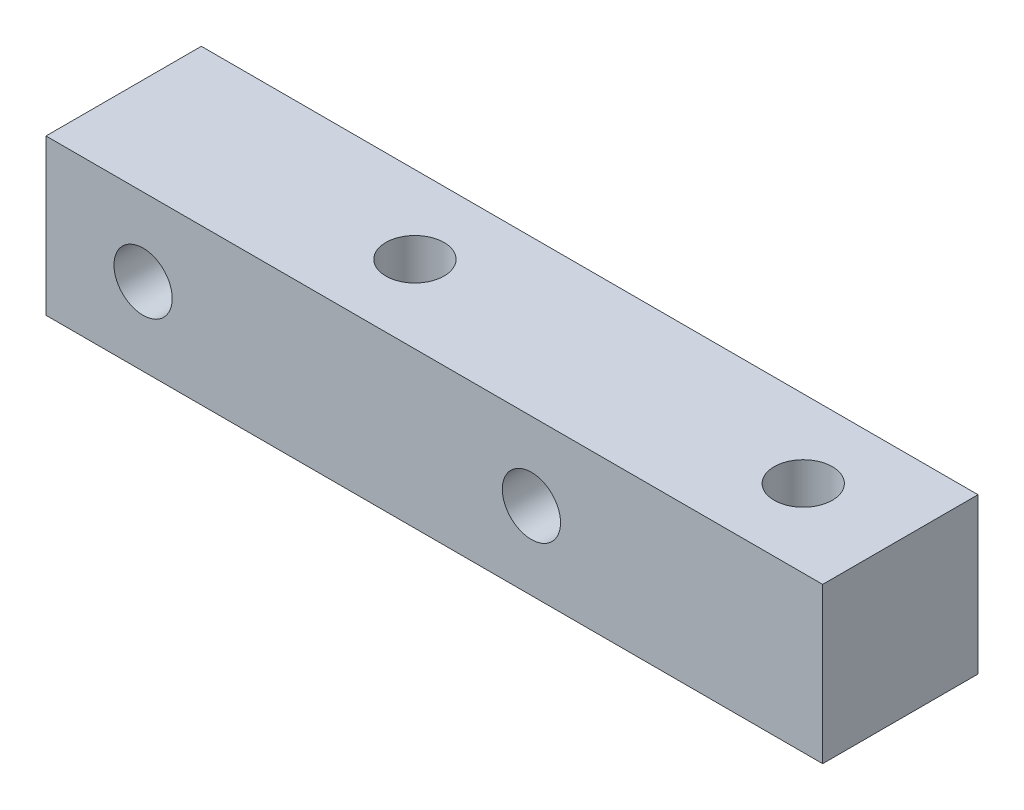
ISO-10303-21;
HEADER;
FILE_DESCRIPTION(('STEP AP214'),'2;1');
FILE_NAME('part.step','',(''),(''),'','','');
FILE_SCHEMA(('AUTOMOTIVE_DESIGN { 1 0 10303 214 1 1 1 1 }'));
ENDSEC;
DATA;
#1=APPLICATION_CONTEXT('core data for automotive mechanical design processes');
#2=APPLICATION_PROTOCOL_DEFINITION('international standard','automotive_design',2000,#1);
#3=PRODUCT_CONTEXT('',#1,'mechanical');
#4=PRODUCT('Part','Part','',(#3));
#5=PRODUCT_RELATED_PRODUCT_CATEGORY('part','',(#4));
#6=PRODUCT_DEFINITION_FORMATION('','',#4);
#7=PRODUCT_DEFINITION_CONTEXT('part definition',#1,'design');
#8=PRODUCT_DEFINITION('design','',#6,#7);
#9=PRODUCT_DEFINITION_SHAPE('','',#8);
#10=(LENGTH_UNIT() NAMED_UNIT(*) SI_UNIT(.MILLI.,.METRE.));
#11=(NAMED_UNIT(*) PLANE_ANGLE_UNIT() SI_UNIT($,.RADIAN.));
#12=(NAMED_UNIT(*) SI_UNIT($,.STERADIAN.) SOLID_ANGLE_UNIT());
#13=UNCERTAINTY_MEASURE_WITH_UNIT(LENGTH_MEASURE(1.E-05),#10,'distance_accuracy_value','');
#14=(GEOMETRIC_REPRESENTATION_CONTEXT(3) GLOBAL_UNCERTAINTY_ASSIGNED_CONTEXT((#13)) GLOBAL_UNIT_ASSIGNED_CONTEXT((#10,
#11,#12)) REPRESENTATION_CONTEXT('',''));
#15=CARTESIAN_POINT('',(0.,0.,0.));
#16=DIRECTION('',(0.,0.,1.));
#17=DIRECTION('',(1.,0.,0.));
#18=AXIS2_PLACEMENT_3D('',#15,#16,#17);
#19=CARTESIAN_POINT('',(20.,8.,4.));
#20=DIRECTION('',(-1.,0.,0.));
#21=DIRECTION('',(0.,0.,1.));
#22=AXIS2_PLACEMENT_3D('',#19,#20,#21);
#23=PLANE('',#22);
#24=DIRECTION('',(0.,0.,-1.));
#25=VECTOR('',#24,1.);
#26=CARTESIAN_POINT('',(20.,0.,4.));
#27=LINE('',#26,#25);
#28=CARTESIAN_POINT('',(20.,0.,4.));
#29=VERTEX_POINT('',#28);
#30=CARTESIAN_POINT('',(20.,0.,-4.));
#31=VERTEX_POINT('',#30);
#32=EDGE_CURVE('E103',#29,#31,#27,.T.);
#33=ORIENTED_EDGE('',*,*,#32,.T.);
#34=DIRECTION('',(0.,-1.,0.));
#35=VECTOR('',#34,1.);
#36=CARTESIAN_POINT('',(20.,8.,-4.));
#37=LINE('',#36,#35);
#38=CARTESIAN_POINT('',(20.,8.,-4.));
#39=VERTEX_POINT('',#38);
#40=EDGE_CURVE('E11',#39,#31,#37,.T.);
#41=ORIENTED_EDGE('',*,*,#40,.F.);
#42=DIRECTION('',(0.,0.,-1.));
#43=VECTOR('',#42,1.);
#44=CARTESIAN_POINT('',(20.,8.,4.));
#45=LINE('',#44,#43);
#46=CARTESIAN_POINT('',(20.,8.,4.));
#47=VERTEX_POINT('',#46);
#48=EDGE_CURVE('E91',#47,#39,#45,.T.);
#49=ORIENTED_EDGE('',*,*,#48,.F.);
#50=DIRECTION('',(0.,-1.,0.));
#51=VECTOR('',#50,1.);
#52=CARTESIAN_POINT('',(20.,8.,4.));
#53=LINE('',#52,#51);
#54=EDGE_CURVE('E99',#47,#29,#53,.T.);
#55=ORIENTED_EDGE('',*,*,#54,.T.);
#56=EDGE_LOOP('',(#33,#41,#49,#55));
#57=FACE_BOUND('',#56,.T.);
#58=ADVANCED_FACE('F40',(#57),#23,.F.);
#59=CARTESIAN_POINT('',(-20.,8.,-4.));
#60=DIRECTION('',(0.,0.,1.));
#61=DIRECTION('',(1.,0.,0.));
#62=AXIS2_PLACEMENT_3D('',#59,#60,#61);
#63=PLANE('',#62);
#64=CARTESIAN_POINT('',(-15.,4.,-4.));
#65=DIRECTION('',(0.,0.,1.));
#66=DIRECTION('',(1.,0.,0.));
#67=AXIS2_PLACEMENT_3D('',#64,#65,#66);
#68=CIRCLE('',#67,1.5);
#69=CARTESIAN_POINT('',(-13.5,4.,-4.));
#70=VERTEX_POINT('',#69);
#71=EDGE_CURVE('E106',#70,#70,#68,.T.);
#72=ORIENTED_EDGE('',*,*,#71,.T.);
#73=EDGE_LOOP('',(#72));
#74=FACE_BOUND('',#73,.T.);
#75=CARTESIAN_POINT('',(5.,4.,-4.));
#76=DIRECTION('',(0.,0.,1.));
#77=DIRECTION('',(1.,0.,0.));
#78=AXIS2_PLACEMENT_3D('',#75,#76,#77);
#79=CIRCLE('',#78,1.5);
#80=CARTESIAN_POINT('',(6.5,4.,-4.));
#81=VERTEX_POINT('',#80);
#82=EDGE_CURVE('E117',#81,#81,#79,.T.);
#83=ORIENTED_EDGE('',*,*,#82,.T.);
#84=EDGE_LOOP('',(#83));
#85=FACE_BOUND('',#84,.T.);
#86=DIRECTION('',(-1.,0.,0.));
#87=VECTOR('',#86,1.);
#88=CARTESIAN_POINT('',(-20.,0.,-4.));
#89=LINE('',#88,#87);
#90=CARTESIAN_POINT('',(-20.,0.,-4.));
#91=VERTEX_POINT('',#90);
#92=EDGE_CURVE('E95',#31,#91,#89,.T.);
#93=ORIENTED_EDGE('',*,*,#92,.T.);
#94=DIRECTION('',(0.,-1.,0.));
#95=VECTOR('',#94,1.);
#96=CARTESIAN_POINT('',(-20.,8.,-4.));
#97=LINE('',#96,#95);
#98=CARTESIAN_POINT('',(-20.,8.,-4.));
#99=VERTEX_POINT('',#98);
#100=EDGE_CURVE('E48',#99,#91,#97,.T.);
#101=ORIENTED_EDGE('',*,*,#100,.F.);
#102=DIRECTION('',(-1.,0.,0.));
#103=VECTOR('',#102,1.);
#104=CARTESIAN_POINT('',(-20.,8.,-4.));
#105=LINE('',#104,#103);
#106=EDGE_CURVE('E86',#39,#99,#105,.T.);
#107=ORIENTED_EDGE('',*,*,#106,.F.);
#108=ORIENTED_EDGE('',*,*,#40,.T.);
#109=EDGE_LOOP('',(#93,#101,#107,#108));
#110=FACE_BOUND('',#109,.T.);
#111=ADVANCED_FACE('F94',(#74,#85,#110),#63,.F.);
#112=CARTESIAN_POINT('',(-20.,8.,4.));
#113=DIRECTION('',(1.,0.,0.));
#114=DIRECTION('',(0.,0.,-1.));
#115=AXIS2_PLACEMENT_3D('',#112,#113,#114);
#116=PLANE('',#115);
#117=DIRECTION('',(0.,0.,1.));
#118=VECTOR('',#117,1.);
#119=CARTESIAN_POINT('',(-20.,0.,4.));
#120=LINE('',#119,#118);
#121=CARTESIAN_POINT('',(-20.,0.,4.));
#122=VERTEX_POINT('',#121);
#123=EDGE_CURVE('E73',#91,#122,#120,.T.);
#124=ORIENTED_EDGE('',*,*,#123,.T.);
#125=DIRECTION('',(0.,-1.,0.));
#126=VECTOR('',#125,1.);
#127=CARTESIAN_POINT('',(-20.,8.,4.));
#128=LINE('',#127,#126);
#129=CARTESIAN_POINT('',(-20.,8.,4.));
#130=VERTEX_POINT('',#129);
#131=EDGE_CURVE('E96',#130,#122,#128,.T.);
#132=ORIENTED_EDGE('',*,*,#131,.F.);
#133=DIRECTION('',(0.,0.,1.));
#134=VECTOR('',#133,1.);
#135=CARTESIAN_POINT('',(-20.,8.,4.));
#136=LINE('',#135,#134);
#137=EDGE_CURVE('E89',#99,#130,#136,.T.);
#138=ORIENTED_EDGE('',*,*,#137,.F.);
#139=ORIENTED_EDGE('',*,*,#100,.T.);
#140=EDGE_LOOP('',(#124,#132,#138,#139));
#141=FACE_BOUND('',#140,.T.);
#142=ADVANCED_FACE('F97',(#141),#116,.F.);
#143=CARTESIAN_POINT('',(-20.,8.,4.));
#144=DIRECTION('',(0.,0.,-1.));
#145=DIRECTION('',(-1.,0.,0.));
#146=AXIS2_PLACEMENT_3D('',#143,#144,#145);
#147=PLANE('',#146);
#148=CARTESIAN_POINT('',(-15.,4.,4.));
#149=DIRECTION('',(0.,0.,1.));
#150=DIRECTION('',(1.,0.,0.));
#151=AXIS2_PLACEMENT_3D('',#148,#149,#150);
#152=CIRCLE('',#151,1.5);
#153=CARTESIAN_POINT('',(-13.5,4.,4.));
#154=VERTEX_POINT('',#153);
#155=EDGE_CURVE('E124',#154,#154,#152,.T.);
#156=ORIENTED_EDGE('',*,*,#155,.F.);
#157=EDGE_LOOP('',(#156));
#158=FACE_BOUND('',#157,.T.);
#159=CARTESIAN_POINT('',(5.,4.,4.));
#160=DIRECTION('',(0.,0.,1.));
#161=DIRECTION('',(1.,0.,0.));
#162=AXIS2_PLACEMENT_3D('',#159,#160,#161);
#163=CIRCLE('',#162,1.5);
#164=CARTESIAN_POINT('',(6.5,4.,4.));
#165=VERTEX_POINT('',#164);
#166=EDGE_CURVE('E120',#165,#165,#163,.T.);
#167=ORIENTED_EDGE('',*,*,#166,.F.);
#168=EDGE_LOOP('',(#167));
#169=FACE_BOUND('',#168,.T.);
#170=DIRECTION('',(1.,0.,0.));
#171=VECTOR('',#170,1.);
#172=CARTESIAN_POINT('',(-20.,0.,4.));
#173=LINE('',#172,#171);
#174=EDGE_CURVE('E79',#122,#29,#173,.T.);
#175=ORIENTED_EDGE('',*,*,#174,.T.);
#176=ORIENTED_EDGE('',*,*,#54,.F.);
#177=DIRECTION('',(1.,0.,0.));
#178=VECTOR('',#177,1.);
#179=CARTESIAN_POINT('',(-20.,8.,4.));
#180=LINE('',#179,#178);
#181=EDGE_CURVE('E56',#130,#47,#180,.T.);
#182=ORIENTED_EDGE('',*,*,#181,.F.);
#183=ORIENTED_EDGE('',*,*,#131,.T.);
#184=EDGE_LOOP('',(#175,#176,#182,#183));
#185=FACE_BOUND('',#184,.T.);
#186=ADVANCED_FACE('F111',(#158,#169,#185),#147,.F.);
#187=CARTESIAN_POINT('',(0.,8.,0.));
#188=DIRECTION('',(0.,-1.,0.));
#189=DIRECTION('',(0.,0.,-1.));
#190=AXIS2_PLACEMENT_3D('',#187,#188,#189);
#191=PLANE('',#190);
#192=CARTESIAN_POINT('',(-5.,8.,0.));
#193=DIRECTION('',(0.,1.,0.));
#194=DIRECTION('',(0.,0.,1.));
#195=AXIS2_PLACEMENT_3D('',#192,#193,#194);
#196=CIRCLE('',#195,1.5);
#197=CARTESIAN_POINT('',(-5.,8.,1.5));
#198=VERTEX_POINT('',#197);
#199=EDGE_CURVE('E135',#198,#198,#196,.T.);
#200=ORIENTED_EDGE('',*,*,#199,.F.);
#201=EDGE_LOOP('',(#200));
#202=FACE_BOUND('',#201,.T.);
#203=CARTESIAN_POINT('',(15.,8.,0.));
#204=DIRECTION('',(0.,1.,0.));
#205=DIRECTION('',(0.,0.,1.));
#206=AXIS2_PLACEMENT_3D('',#203,#204,#205);
#207=CIRCLE('',#206,1.5);
#208=CARTESIAN_POINT('',(15.,8.,1.5));
#209=VERTEX_POINT('',#208);
#210=EDGE_CURVE('E132',#209,#209,#207,.T.);
#211=ORIENTED_EDGE('',*,*,#210,.F.);
#212=EDGE_LOOP('',(#211));
#213=FACE_BOUND('',#212,.T.);
#214=ORIENTED_EDGE('',*,*,#48,.T.);
#215=ORIENTED_EDGE('',*,*,#106,.T.);
#216=ORIENTED_EDGE('',*,*,#137,.T.);
#217=ORIENTED_EDGE('',*,*,#181,.T.);
#218=EDGE_LOOP('',(#214,#215,#216,#217));
#219=FACE_BOUND('',#218,.T.);
#220=ADVANCED_FACE('F87',(#202,#213,#219),#191,.F.);
#221=CARTESIAN_POINT('',(0.,0.,0.));
#222=DIRECTION('',(0.,-1.,0.));
#223=DIRECTION('',(0.,0.,-1.));
#224=AXIS2_PLACEMENT_3D('',#221,#222,#223);
#225=PLANE('',#224);
#226=CARTESIAN_POINT('',(-5.,0.,0.));
#227=DIRECTION('',(0.,1.,0.));
#228=DIRECTION('',(0.,0.,1.));
#229=AXIS2_PLACEMENT_3D('',#226,#227,#228);
#230=CIRCLE('',#229,1.5);
#231=CARTESIAN_POINT('',(-5.,0.,1.5));
#232=VERTEX_POINT('',#231);
#233=EDGE_CURVE('E121',#232,#232,#230,.T.);
#234=ORIENTED_EDGE('',*,*,#233,.T.);
#235=EDGE_LOOP('',(#234));
#236=FACE_BOUND('',#235,.T.);
#237=CARTESIAN_POINT('',(15.,0.,0.));
#238=DIRECTION('',(0.,1.,0.));
#239=DIRECTION('',(0.,0.,1.));
#240=AXIS2_PLACEMENT_3D('',#237,#238,#239);
#241=CIRCLE('',#240,1.5);
#242=CARTESIAN_POINT('',(15.,0.,1.5));
#243=VERTEX_POINT('',#242);
#244=EDGE_CURVE('E129',#243,#243,#241,.T.);
#245=ORIENTED_EDGE('',*,*,#244,.T.);
#246=EDGE_LOOP('',(#245));
#247=FACE_BOUND('',#246,.T.);
#248=ORIENTED_EDGE('',*,*,#32,.F.);
#249=ORIENTED_EDGE('',*,*,#174,.F.);
#250=ORIENTED_EDGE('',*,*,#123,.F.);
#251=ORIENTED_EDGE('',*,*,#92,.F.);
#252=EDGE_LOOP('',(#248,#249,#250,#251));
#253=FACE_BOUND('',#252,.T.);
#254=ADVANCED_FACE('F114',(#236,#247,#253),#225,.T.);
#255=CARTESIAN_POINT('',(5.,4.,-4.));
#256=DIRECTION('',(0.,0.,1.));
#257=DIRECTION('',(1.,0.,0.));
#258=AXIS2_PLACEMENT_3D('',#255,#256,#257);
#259=CYLINDRICAL_SURFACE('',#258,1.5);
#260=ORIENTED_EDGE('',*,*,#82,.F.);
#261=EDGE_LOOP('',(#260));
#262=FACE_BOUND('',#261,.T.);
#263=ORIENTED_EDGE('',*,*,#166,.T.);
#264=EDGE_LOOP('',(#263));
#265=FACE_BOUND('',#264,.T.);
#266=ADVANCED_FACE('F162',(#262,#265),#259,.F.);
#267=CARTESIAN_POINT('',(-15.,4.,-4.));
#268=DIRECTION('',(0.,0.,1.));
#269=DIRECTION('',(1.,0.,0.));
#270=AXIS2_PLACEMENT_3D('',#267,#268,#269);
#271=CYLINDRICAL_SURFACE('',#270,1.5);
#272=ORIENTED_EDGE('',*,*,#71,.F.);
#273=EDGE_LOOP('',(#272));
#274=FACE_BOUND('',#273,.T.);
#275=ORIENTED_EDGE('',*,*,#155,.T.);
#276=EDGE_LOOP('',(#275));
#277=FACE_BOUND('',#276,.T.);
#278=ADVANCED_FACE('F156',(#274,#277),#271,.F.);
#279=CARTESIAN_POINT('',(15.,0.,0.));
#280=DIRECTION('',(0.,1.,0.));
#281=DIRECTION('',(0.,0.,1.));
#282=AXIS2_PLACEMENT_3D('',#279,#280,#281);
#283=CYLINDRICAL_SURFACE('',#282,1.5);
#284=ORIENTED_EDGE('',*,*,#244,.F.);
#285=EDGE_LOOP('',(#284));
#286=FACE_BOUND('',#285,.T.);
#287=ORIENTED_EDGE('',*,*,#210,.T.);
#288=EDGE_LOOP('',(#287));
#289=FACE_BOUND('',#288,.T.);
#290=ADVANCED_FACE('F146',(#286,#289),#283,.F.);
#291=CARTESIAN_POINT('',(-5.,0.,0.));
#292=DIRECTION('',(0.,1.,0.));
#293=DIRECTION('',(0.,0.,1.));
#294=AXIS2_PLACEMENT_3D('',#291,#292,#293);
#295=CYLINDRICAL_SURFACE('',#294,1.5);
#296=ORIENTED_EDGE('',*,*,#233,.F.);
#297=EDGE_LOOP('',(#296));
#298=FACE_BOUND('',#297,.T.);
#299=ORIENTED_EDGE('',*,*,#199,.T.);
#300=EDGE_LOOP('',(#299));
#301=FACE_BOUND('',#300,.T.);
#302=ADVANCED_FACE('F143',(#298,#301),#295,.F.);
#303=CLOSED_SHELL('',(#58,#111,#142,#186,#220,#254,#266,#278,#290,#302));
#304=MANIFOLD_SOLID_BREP('B2',#303);
#305=ADVANCED_BREP_SHAPE_REPRESENTATION('',(#18,#304),#14);
#306=SHAPE_DEFINITION_REPRESENTATION(#9,#305);
ENDSEC;
END-ISO-10303-21;
